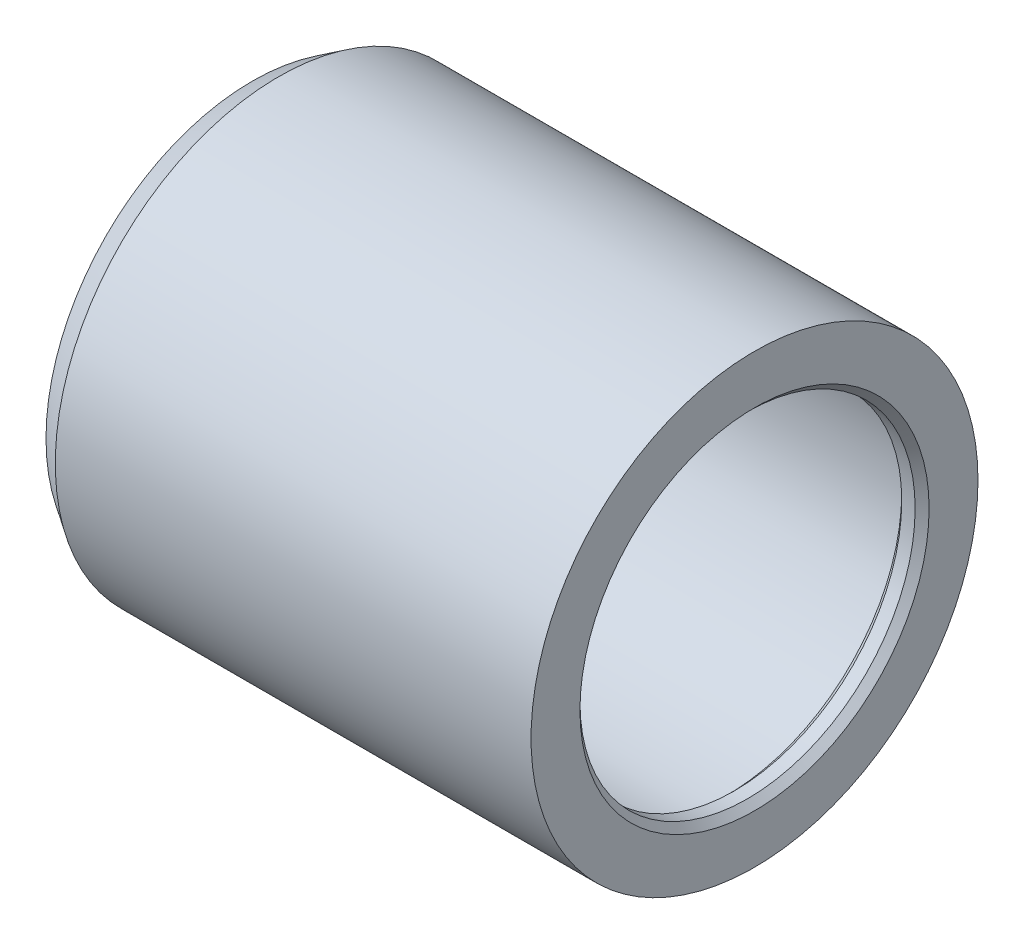
ISO-10303-21;
HEADER;
FILE_DESCRIPTION(('STEP AP214'),'2;1');
FILE_NAME('part.step','',(''),(''),'','','');
FILE_SCHEMA(('AUTOMOTIVE_DESIGN { 1 0 10303 214 1 1 1 1 }'));
ENDSEC;
DATA;
#1=APPLICATION_CONTEXT('core data for automotive mechanical design processes');
#2=APPLICATION_PROTOCOL_DEFINITION('international standard','automotive_design',2000,#1);
#3=PRODUCT_CONTEXT('',#1,'mechanical');
#4=PRODUCT('Part','Part','',(#3));
#5=PRODUCT_RELATED_PRODUCT_CATEGORY('part','',(#4));
#6=PRODUCT_DEFINITION_FORMATION('','',#4);
#7=PRODUCT_DEFINITION_CONTEXT('part definition',#1,'design');
#8=PRODUCT_DEFINITION('design','',#6,#7);
#9=PRODUCT_DEFINITION_SHAPE('','',#8);
#10=(LENGTH_UNIT() NAMED_UNIT(*) SI_UNIT(.MILLI.,.METRE.));
#11=(NAMED_UNIT(*) PLANE_ANGLE_UNIT() SI_UNIT($,.RADIAN.));
#12=(NAMED_UNIT(*) SI_UNIT($,.STERADIAN.) SOLID_ANGLE_UNIT());
#13=UNCERTAINTY_MEASURE_WITH_UNIT(LENGTH_MEASURE(1.E-05),#10,'distance_accuracy_value','');
#14=(GEOMETRIC_REPRESENTATION_CONTEXT(3) GLOBAL_UNCERTAINTY_ASSIGNED_CONTEXT((#13)) GLOBAL_UNIT_ASSIGNED_CONTEXT((#10,
#11,#12)) REPRESENTATION_CONTEXT('',''));
#15=CARTESIAN_POINT('',(0.,0.,0.));
#16=DIRECTION('',(0.,0.,1.));
#17=DIRECTION('',(1.,0.,0.));
#18=AXIS2_PLACEMENT_3D('',#15,#16,#17);
#19=CARTESIAN_POINT('',(0.,0.,0.));
#20=DIRECTION('',(1.,0.,0.));
#21=DIRECTION('',(0.,0.,-1.));
#22=AXIS2_PLACEMENT_3D('',#19,#20,#21);
#23=CYLINDRICAL_SURFACE('',#22,6.);
#24=CARTESIAN_POINT('',(-0.72982349560166,0.,0.));
#25=DIRECTION('',(-1.,0.,0.));
#26=DIRECTION('',(0.,0.,1.));
#27=AXIS2_PLACEMENT_3D('',#24,#25,#26);
#28=CIRCLE('',#27,6.);
#29=CARTESIAN_POINT('',(-0.72982349560166,0.,6.));
#30=VERTEX_POINT('',#29);
#31=EDGE_CURVE('E54',#30,#30,#28,.T.);
#32=ORIENTED_EDGE('',*,*,#31,.T.);
#33=EDGE_LOOP('',(#32));
#34=FACE_BOUND('',#33,.T.);
#35=CARTESIAN_POINT('',(-0.249999999999996,0.,0.));
#36=DIRECTION('',(1.,0.,0.));
#37=DIRECTION('',(0.,0.,-1.));
#38=AXIS2_PLACEMENT_3D('',#35,#36,#37);
#39=CIRCLE('',#38,6.);
#40=CARTESIAN_POINT('',(-0.249999999999996,0.,-6.));
#41=VERTEX_POINT('',#40);
#42=EDGE_CURVE('E59',#41,#41,#39,.T.);
#43=ORIENTED_EDGE('',*,*,#42,.T.);
#44=EDGE_LOOP('',(#43));
#45=FACE_BOUND('',#44,.T.);
#46=ADVANCED_FACE('F45',(#34,#45),#23,.F.);
#47=CARTESIAN_POINT('',(0.,6.,0.));
#48=DIRECTION('',(1.,0.,0.));
#49=DIRECTION('',(0.,0.,-1.));
#50=AXIS2_PLACEMENT_3D('',#47,#48,#49);
#51=PLANE('',#50);
#52=CARTESIAN_POINT('',(0.,0.,0.));
#53=DIRECTION('',(1.,0.,0.));
#54=DIRECTION('',(0.,0.,-1.));
#55=AXIS2_PLACEMENT_3D('',#52,#53,#54);
#56=CIRCLE('',#55,6.25);
#57=CARTESIAN_POINT('',(0.,0.,-6.25));
#58=VERTEX_POINT('',#57);
#59=EDGE_CURVE('E10',#58,#58,#56,.F.);
#60=ORIENTED_EDGE('',*,*,#59,.T.);
#61=EDGE_LOOP('',(#60));
#62=FACE_BOUND('',#61,.T.);
#63=CARTESIAN_POINT('',(0.,0.,0.));
#64=DIRECTION('',(1.,0.,0.));
#65=DIRECTION('',(0.,0.,-1.));
#66=AXIS2_PLACEMENT_3D('',#63,#64,#65);
#67=CIRCLE('',#66,8.);
#68=CARTESIAN_POINT('',(0.,0.,-8.));
#69=VERTEX_POINT('',#68);
#70=EDGE_CURVE('E78',#69,#69,#67,.T.);
#71=ORIENTED_EDGE('',*,*,#70,.T.);
#72=EDGE_LOOP('',(#71));
#73=FACE_BOUND('',#72,.T.);
#74=ADVANCED_FACE('F113',(#62,#73),#51,.T.);
#75=CARTESIAN_POINT('',(0.,0.,0.));
#76=DIRECTION('',(1.,0.,0.));
#77=DIRECTION('',(0.,0.,-1.));
#78=AXIS2_PLACEMENT_3D('',#75,#76,#77);
#79=CYLINDRICAL_SURFACE('',#78,8.);
#80=CARTESIAN_POINT('',(-17.0311628343701,0.,0.));
#81=DIRECTION('',(1.,0.,0.));
#82=DIRECTION('',(0.,0.,-1.));
#83=AXIS2_PLACEMENT_3D('',#80,#81,#82);
#84=CIRCLE('',#83,8.);
#85=CARTESIAN_POINT('',(-17.0311628343701,0.,-8.));
#86=VERTEX_POINT('',#85);
#87=EDGE_CURVE('E82',#86,#86,#84,.T.);
#88=ORIENTED_EDGE('',*,*,#87,.T.);
#89=EDGE_LOOP('',(#88));
#90=FACE_BOUND('',#89,.T.);
#91=ORIENTED_EDGE('',*,*,#70,.F.);
#92=EDGE_LOOP('',(#91));
#93=FACE_BOUND('',#92,.T.);
#94=ADVANCED_FACE('F119',(#90,#93),#79,.T.);
#95=CARTESIAN_POINT('',(-17.0311628343701,0.,0.));
#96=DIRECTION('',(1.,0.,0.));
#97=DIRECTION('',(0.,0.,-1.));
#98=AXIS2_PLACEMENT_3D('',#95,#96,#97);
#99=CONICAL_SURFACE('',#98,8.,0.575958653158122);
#100=CARTESIAN_POINT('',(-17.9798234956017,0.,0.));
#101=DIRECTION('',(1.,0.,0.));
#102=DIRECTION('',(0.,0.,-1.));
#103=AXIS2_PLACEMENT_3D('',#100,#101,#102);
#104=CIRCLE('',#103,7.38393256322848);
#105=CARTESIAN_POINT('',(-17.9798234956017,0.,-7.38393256322848));
#106=VERTEX_POINT('',#105);
#107=EDGE_CURVE('E86',#106,#106,#104,.T.);
#108=ORIENTED_EDGE('',*,*,#107,.T.);
#109=EDGE_LOOP('',(#108));
#110=FACE_BOUND('',#109,.T.);
#111=ORIENTED_EDGE('',*,*,#87,.F.);
#112=EDGE_LOOP('',(#111));
#113=FACE_BOUND('',#112,.T.);
#114=ADVANCED_FACE('F171',(#110,#113),#99,.T.);
#115=CARTESIAN_POINT('',(-17.9798234956017,7.38393256322848,0.));
#116=DIRECTION('',(-1.,0.,0.));
#117=DIRECTION('',(0.,0.,1.));
#118=AXIS2_PLACEMENT_3D('',#115,#116,#117);
#119=PLANE('',#118);
#120=CARTESIAN_POINT('',(-17.9798234956017,0.,0.));
#121=DIRECTION('',(-1.,0.,0.));
#122=DIRECTION('',(0.,0.,1.));
#123=AXIS2_PLACEMENT_3D('',#120,#121,#122);
#124=CIRCLE('',#123,7.1380718878482);
#125=CARTESIAN_POINT('',(-17.9798234956017,0.,7.1380718878482));
#126=VERTEX_POINT('',#125);
#127=EDGE_CURVE('E74',#126,#126,#124,.F.);
#128=ORIENTED_EDGE('',*,*,#127,.T.);
#129=EDGE_LOOP('',(#128));
#130=FACE_BOUND('',#129,.T.);
#131=ORIENTED_EDGE('',*,*,#107,.F.);
#132=EDGE_LOOP('',(#131));
#133=FACE_BOUND('',#132,.T.);
#134=ADVANCED_FACE('F109',(#130,#133),#119,.T.);
#135=CARTESIAN_POINT('',(0.,0.,0.));
#136=DIRECTION('',(1.,0.,0.));
#137=DIRECTION('',(0.,0.,-1.));
#138=AXIS2_PLACEMENT_3D('',#135,#136,#137);
#139=CYLINDRICAL_SURFACE('',#138,6.8880718878482);
#140=CARTESIAN_POINT('',(-17.7298234956017,0.,0.));
#141=DIRECTION('',(-1.,0.,0.));
#142=DIRECTION('',(0.,0.,1.));
#143=AXIS2_PLACEMENT_3D('',#140,#141,#142);
#144=CIRCLE('',#143,6.8880718878482);
#145=CARTESIAN_POINT('',(-17.7298234956017,0.,6.8880718878482));
#146=VERTEX_POINT('',#145);
#147=EDGE_CURVE('E70',#146,#146,#144,.T.);
#148=ORIENTED_EDGE('',*,*,#147,.T.);
#149=EDGE_LOOP('',(#148));
#150=FACE_BOUND('',#149,.T.);
#151=CARTESIAN_POINT('',(-0.979823495601662,0.,0.));
#152=DIRECTION('',(1.,0.,0.));
#153=DIRECTION('',(0.,0.,-1.));
#154=AXIS2_PLACEMENT_3D('',#151,#152,#153);
#155=CIRCLE('',#154,6.8880718878482);
#156=CARTESIAN_POINT('',(-0.979823495601662,0.,-6.8880718878482));
#157=VERTEX_POINT('',#156);
#158=EDGE_CURVE('E90',#157,#157,#155,.T.);
#159=ORIENTED_EDGE('',*,*,#158,.T.);
#160=EDGE_LOOP('',(#159));
#161=FACE_BOUND('',#160,.T.);
#162=ADVANCED_FACE('F95',(#150,#161),#139,.F.);
#163=CARTESIAN_POINT('',(-0.979823495601662,6.8880718878482,0.));
#164=DIRECTION('',(-1.,0.,0.));
#165=DIRECTION('',(0.,0.,1.));
#166=AXIS2_PLACEMENT_3D('',#163,#164,#165);
#167=PLANE('',#166);
#168=CARTESIAN_POINT('',(-0.979823495601662,0.,0.));
#169=DIRECTION('',(-1.,0.,0.));
#170=DIRECTION('',(0.,0.,1.));
#171=AXIS2_PLACEMENT_3D('',#168,#169,#170);
#172=CIRCLE('',#171,6.25);
#173=CARTESIAN_POINT('',(-0.979823495601662,0.,6.25));
#174=VERTEX_POINT('',#173);
#175=EDGE_CURVE('E64',#174,#174,#172,.F.);
#176=ORIENTED_EDGE('',*,*,#175,.T.);
#177=EDGE_LOOP('',(#176));
#178=FACE_BOUND('',#177,.T.);
#179=ORIENTED_EDGE('',*,*,#158,.F.);
#180=EDGE_LOOP('',(#179));
#181=FACE_BOUND('',#180,.T.);
#182=ADVANCED_FACE('F97',(#178,#181),#167,.T.);
#183=CARTESIAN_POINT('',(-17.9798234956017,0.,0.));
#184=DIRECTION('',(-1.,0.,0.));
#185=DIRECTION('',(0.,0.,1.));
#186=AXIS2_PLACEMENT_3D('',#183,#184,#185);
#187=CONICAL_SURFACE('',#186,7.1380718878482,0.785398163397452);
#188=ORIENTED_EDGE('',*,*,#147,.F.);
#189=EDGE_LOOP('',(#188));
#190=FACE_BOUND('',#189,.T.);
#191=ORIENTED_EDGE('',*,*,#127,.F.);
#192=EDGE_LOOP('',(#191));
#193=FACE_BOUND('',#192,.T.);
#194=ADVANCED_FACE('F99',(#190,#193),#187,.F.);
#195=CARTESIAN_POINT('',(-0.979823495601662,0.,0.));
#196=DIRECTION('',(-1.,0.,0.));
#197=DIRECTION('',(0.,0.,1.));
#198=AXIS2_PLACEMENT_3D('',#195,#196,#197);
#199=CONICAL_SURFACE('',#198,6.25,0.785398163397448);
#200=ORIENTED_EDGE('',*,*,#31,.F.);
#201=EDGE_LOOP('',(#200));
#202=FACE_BOUND('',#201,.T.);
#203=ORIENTED_EDGE('',*,*,#175,.F.);
#204=EDGE_LOOP('',(#203));
#205=FACE_BOUND('',#204,.T.);
#206=ADVANCED_FACE('F106',(#202,#205),#199,.F.);
#207=CARTESIAN_POINT('',(-0.249999999999996,0.,0.));
#208=DIRECTION('',(1.,0.,0.));
#209=DIRECTION('',(0.,0.,-1.));
#210=AXIS2_PLACEMENT_3D('',#207,#208,#209);
#211=CONICAL_SURFACE('',#210,6.,0.785398163397455);
#212=ORIENTED_EDGE('',*,*,#59,.F.);
#213=EDGE_LOOP('',(#212));
#214=FACE_BOUND('',#213,.T.);
#215=ORIENTED_EDGE('',*,*,#42,.F.);
#216=EDGE_LOOP('',(#215));
#217=FACE_BOUND('',#216,.T.);
#218=ADVANCED_FACE('F48',(#214,#217),#211,.F.);
#219=CLOSED_SHELL('',(#46,#74,#94,#114,#134,#162,#182,#194,#206,#218));
#220=MANIFOLD_SOLID_BREP('B2',#219);
#221=ADVANCED_BREP_SHAPE_REPRESENTATION('',(#18,#220),#14);
#222=SHAPE_DEFINITION_REPRESENTATION(#9,#221);
ENDSEC;
END-ISO-10303-21;
